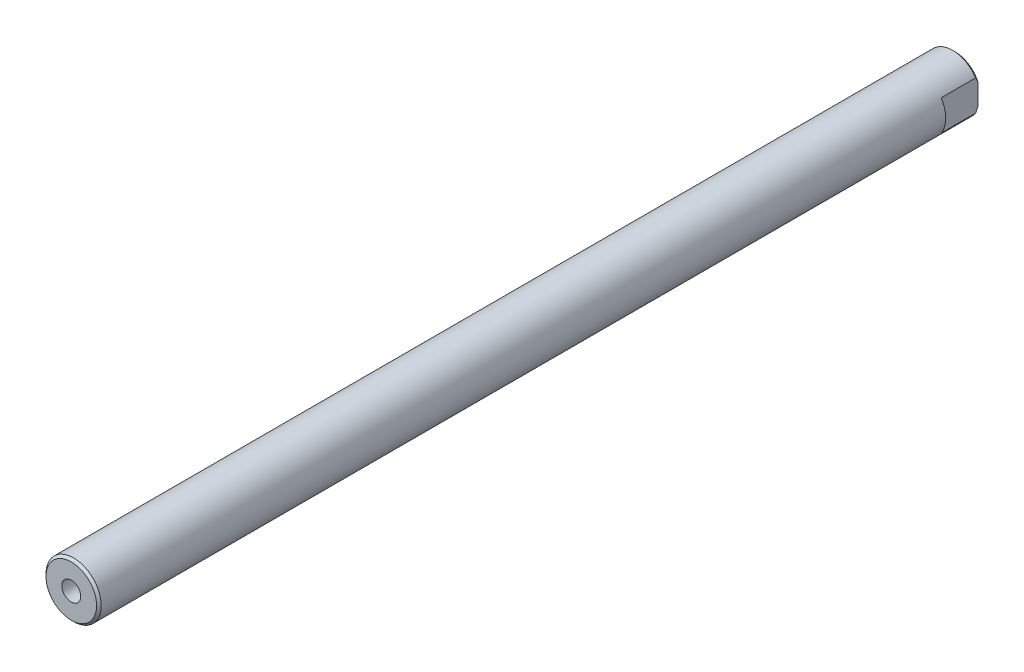
ISO-10303-21;
HEADER;
FILE_DESCRIPTION(('STEP AP214'),'2;1');
FILE_NAME('part.step','',(''),(''),'','','');
FILE_SCHEMA(('AUTOMOTIVE_DESIGN { 1 0 10303 214 1 1 1 1 }'));
ENDSEC;
DATA;
#1=APPLICATION_CONTEXT('core data for automotive mechanical design processes');
#2=APPLICATION_PROTOCOL_DEFINITION('international standard','automotive_design',2000,#1);
#3=PRODUCT_CONTEXT('',#1,'mechanical');
#4=PRODUCT('Part','Part','',(#3));
#5=PRODUCT_RELATED_PRODUCT_CATEGORY('part','',(#4));
#6=PRODUCT_DEFINITION_FORMATION('','',#4);
#7=PRODUCT_DEFINITION_CONTEXT('part definition',#1,'design');
#8=PRODUCT_DEFINITION('design','',#6,#7);
#9=PRODUCT_DEFINITION_SHAPE('','',#8);
#10=(LENGTH_UNIT() NAMED_UNIT(*) SI_UNIT(.MILLI.,.METRE.));
#11=(NAMED_UNIT(*) PLANE_ANGLE_UNIT() SI_UNIT($,.RADIAN.));
#12=(NAMED_UNIT(*) SI_UNIT($,.STERADIAN.) SOLID_ANGLE_UNIT());
#13=UNCERTAINTY_MEASURE_WITH_UNIT(LENGTH_MEASURE(1.E-05),#10,'distance_accuracy_value','');
#14=(GEOMETRIC_REPRESENTATION_CONTEXT(3) GLOBAL_UNCERTAINTY_ASSIGNED_CONTEXT((#13)) GLOBAL_UNIT_ASSIGNED_CONTEXT((#10,
#11,#12)) REPRESENTATION_CONTEXT('',''));
#15=CARTESIAN_POINT('',(0.,0.,0.));
#16=DIRECTION('',(0.,0.,1.));
#17=DIRECTION('',(1.,0.,0.));
#18=AXIS2_PLACEMENT_3D('',#15,#16,#17);
#19=CARTESIAN_POINT('',(0.,0.,0.793750000000149));
#20=DIRECTION('',(0.,0.,1.));
#21=DIRECTION('',(1.,0.,0.));
#22=AXIS2_PLACEMENT_3D('',#19,#20,#21);
#23=CONICAL_SURFACE('',#22,9.525,0.785398163397464);
#24=CARTESIAN_POINT('',(-7.9375,11.6014360034925,5.32567795717243));
#25=CARTESIAN_POINT('',(-7.9375,11.3954741282638,5.15570776723856));
#26=CARTESIAN_POINT('',(-7.9375,11.1888141040513,4.98657786812083));
#27=CARTESIAN_POINT('',(-7.9375,10.7738848658229,4.65029059370863));
#28=CARTESIAN_POINT('',(-7.9375,10.5656155993229,4.48313328320164));
#29=CARTESIAN_POINT('',(-7.9375,10.1470080264703,4.15088760550852));
#30=CARTESIAN_POINT('',(-7.9375,9.93666746697199,3.98580207327672));
#31=CARTESIAN_POINT('',(-7.9375,9.51392132690025,3.65829127244558));
#32=CARTESIAN_POINT('',(-7.9375,9.30151573600521,3.49586601715399));
#33=CARTESIAN_POINT('',(-7.9375,8.86948446203999,3.17047280109903));
#34=CARTESIAN_POINT('',(-7.9375,8.64980452362687,3.00757675080383));
#35=CARTESIAN_POINT('',(-7.9375,8.20762068370955,2.68566572531648));
#36=CARTESIAN_POINT('',(-7.9375,7.9851168381941,2.52665067335909));
#37=CARTESIAN_POINT('',(-7.9375,7.53694950119995,2.21333045940023));
#38=CARTESIAN_POINT('',(-7.9375,7.3112874008082,2.05902331342647));
#39=CARTESIAN_POINT('',(-7.9375,6.85623203289005,1.75602898709473));
#40=CARTESIAN_POINT('',(-7.9375,6.62683896629286,1.60734150551671));
#41=CARTESIAN_POINT('',(-7.9375,6.09743217351012,1.27518215385517));
#42=CARTESIAN_POINT('',(-7.9375,5.79600650697764,1.09394234503633));
#43=CARTESIAN_POINT('',(-7.9375,5.18479308583082,0.746241008845733));
#44=CARTESIAN_POINT('',(-7.9375,4.87500790022603,0.57977500720809));
#45=CARTESIAN_POINT('',(-7.9375,4.24717673370327,0.26700886733065));
#46=CARTESIAN_POINT('',(-7.9375,3.92917773276971,0.120615453319362));
#47=CARTESIAN_POINT('',(-7.9375,3.28264467487299,-0.146773886604975));
#48=CARTESIAN_POINT('',(-7.9375,2.95411664296996,-0.267784048750884));
#49=CARTESIAN_POINT('',(-7.9375,2.3901421033224,-0.444580000607309));
#50=CARTESIAN_POINT('',(-7.9375,2.15739698732743,-0.508957586163685));
#51=CARTESIAN_POINT('',(-7.9375,1.68759488708778,-0.619541449607157));
#52=CARTESIAN_POINT('',(-7.9375,1.45053850437819,-0.665750242474339));
#53=CARTESIAN_POINT('',(-7.9375,0.973982925679542,-0.737673554850526));
#54=CARTESIAN_POINT('',(-7.9375,0.734492600319058,-0.763446017674142));
#55=CARTESIAN_POINT('',(-7.9375,0.254149503311977,-0.793299105345449));
#56=CARTESIAN_POINT('',(-7.9375,0.0132967829865174,-0.797380541913547));
#57=CARTESIAN_POINT('',(-7.9375,-0.468009612623792,-0.783608551396996));
#58=CARTESIAN_POINT('',(-7.9375,-0.70846265402124,-0.765733335389718));
#59=CARTESIAN_POINT('',(-7.9375,-1.18686519119779,-0.709024715447612));
#60=CARTESIAN_POINT('',(-7.9375,-1.42481446713333,-0.670189486514935));
#61=CARTESIAN_POINT('',(-7.9375,-1.89757315431518,-0.573374556133903));
#62=CARTESIAN_POINT('',(-7.9375,-2.13236916585276,-0.51533031770074));
#63=CARTESIAN_POINT('',(-7.9375,-2.59715748152029,-0.382627814204618));
#64=CARTESIAN_POINT('',(-7.9375,-2.82714974617842,-0.307969412683753));
#65=CARTESIAN_POINT('',(-7.9375,-3.32292514190079,-0.129913750873734));
#66=CARTESIAN_POINT('',(-7.9375,-3.58771252050722,-0.0237629755832509));
#67=CARTESIAN_POINT('',(-7.9375,-4.11045852754002,0.204320036250611));
#68=CARTESIAN_POINT('',(-7.9375,-4.36841392511831,0.326259584287772));
#69=CARTESIAN_POINT('',(-7.9375,-4.87840789335136,0.582939808835037));
#70=CARTESIAN_POINT('',(-7.9375,-5.13043498776631,0.717703114549743));
#71=CARTESIAN_POINT('',(-7.9375,-5.62876456164695,0.997283684746736));
#72=CARTESIAN_POINT('',(-7.9375,-5.87506786030298,1.14209949853624));
#73=CARTESIAN_POINT('',(-7.9375,-6.36431013173231,1.44079890476715));
#74=CARTESIAN_POINT('',(-7.9375,-6.60721644348262,1.59473574090025));
#75=CARTESIAN_POINT('',(-7.9375,-7.08868671208285,1.90924675489272));
#76=CARTESIAN_POINT('',(-7.9375,-7.32725054237946,2.0698211257457));
#77=CARTESIAN_POINT('',(-7.9375,-7.80040441956701,2.39623490523143));
#78=CARTESIAN_POINT('',(-7.9375,-8.03499801323439,2.56206918774313));
#79=CARTESIAN_POINT('',(-7.9375,-8.500952099172,2.89819833973861));
#80=CARTESIAN_POINT('',(-7.9375,-8.73231266321962,3.06849310995179));
#81=CARTESIAN_POINT('',(-7.9375,-9.18794896552464,3.409587365432));
#82=CARTESIAN_POINT('',(-7.9375,-9.41227632364913,3.58031802966819));
#83=CARTESIAN_POINT('',(-7.9375,-9.85861577505485,3.9248191689226));
#84=CARTESIAN_POINT('',(-7.9375,-10.0806276446775,4.09858993332941));
#85=CARTESIAN_POINT('',(-7.9375,-10.5200922126934,4.44670278107558));
#86=CARTESIAN_POINT('',(-7.9375,-10.7375680282526,4.62101572569596));
#87=CARTESIAN_POINT('',(-7.9375,-11.1707609997737,4.97180733271033));
#88=CARTESIAN_POINT('',(-7.9375,-11.3864781840771,5.14828596008746));
#89=CARTESIAN_POINT('',(-7.9375,-11.6014360034926,5.32567795717243));
#90=B_SPLINE_CURVE_WITH_KNOTS('',3,(#24,#25,#26,#27,#28,#29,#30,#31,#32,#33,#34,#35,#36,#37,#38,
#39,#40,#41,#42,#43,#44,#45,#46,#47,#48,#49,#50,#51,#52,#53,#54,#55,#56,#57,#58,#59,#60,#61,#62,
#63,#64,#65,#66,#67,#68,#69,#70,#71,#72,#73,#74,#75,#76,#77,#78,#79,#80,#81,#82,#83,#84,#85,#86,
#87,#88,#89),.UNSPECIFIED.,.F.,.F.,(4,2,2,2,2,2,2,2,2,2,2,2,2,2,2,2,2,2,2,2,2,2,2,2,2,2,2,2,2,2,
2,2,4),(0.,0.801122014064893,1.60227026726658,2.40441595709641,3.20656565834575,
4.02698671789724,4.84739153654247,5.66744571188917,6.48745586893487,7.54228804991552,
8.59679967569598,9.64623175308704,10.6950736719304,11.4189157513683,12.1426575990584,
12.8643400033196,13.5859954006309,14.3083675194414,15.0308025456699,15.7556898223754,
16.4805830530523,17.3357464059968,18.1913071954248,19.0484067663654,19.9053829040754,
20.7679797303853,21.6306016553112,22.4924072773821,23.3541937357677,24.1998858025455,
25.0456588139614,25.8817820988934,26.7178918823395),.UNSPECIFIED.);
#91=CARTESIAN_POINT('',(-7.9375,5.2651418546892,0.793750000000371));
#92=VERTEX_POINT('',#91);
#93=CARTESIAN_POINT('',(-7.9375,3.63741945787052,0.));
#94=VERTEX_POINT('',#93);
#95=EDGE_CURVE('E11',#92,#94,#90,.T.);
#96=ORIENTED_EDGE('',*,*,#95,.F.);
#97=CARTESIAN_POINT('',(0.,0.,0.793750000000149));
#98=DIRECTION('',(0.,0.,1.));
#99=DIRECTION('',(1.,0.,0.));
#100=AXIS2_PLACEMENT_3D('',#97,#98,#99);
#101=CIRCLE('',#100,9.525);
#102=CARTESIAN_POINT('',(7.9375,5.2651418546892,0.793750000000371));
#103=VERTEX_POINT('',#102);
#104=EDGE_CURVE('E115',#103,#92,#101,.T.);
#105=ORIENTED_EDGE('',*,*,#104,.F.);
#106=CARTESIAN_POINT('',(7.9375,-11.6014360034926,5.32567795717243));
#107=CARTESIAN_POINT('',(7.9375,-11.3954741282639,5.15570776723858));
#108=CARTESIAN_POINT('',(7.9375,-11.1888141040513,4.98657786812085));
#109=CARTESIAN_POINT('',(7.9375,-10.7738848658229,4.65029059370865));
#110=CARTESIAN_POINT('',(7.9375,-10.5656155993229,4.48313328320165));
#111=CARTESIAN_POINT('',(7.9375,-10.1470080264703,4.15088760550853));
#112=CARTESIAN_POINT('',(7.9375,-9.93666746697201,3.98580207327673));
#113=CARTESIAN_POINT('',(7.9375,-9.51392132690026,3.6582912724456));
#114=CARTESIAN_POINT('',(7.9375,-9.30151573600523,3.495866017154));
#115=CARTESIAN_POINT('',(7.9375,-8.86948446204,3.17047280109904));
#116=CARTESIAN_POINT('',(7.9375,-8.64980452362688,3.00757675080384));
#117=CARTESIAN_POINT('',(7.9375,-8.20762068370956,2.68566572531649));
#118=CARTESIAN_POINT('',(7.9375,-7.9851168381941,2.5266506733591));
#119=CARTESIAN_POINT('',(7.9375,-7.53694950119996,2.21333045940023));
#120=CARTESIAN_POINT('',(7.9375,-7.3112874008082,2.05902331342647));
#121=CARTESIAN_POINT('',(7.9375,-6.85623203289005,1.75602898709473));
#122=CARTESIAN_POINT('',(7.9375,-6.62683896629286,1.60734150551671));
#123=CARTESIAN_POINT('',(7.9375,-6.09743217351012,1.27518215385517));
#124=CARTESIAN_POINT('',(7.9375,-5.79600650697764,1.09394234503633));
#125=CARTESIAN_POINT('',(7.9375,-5.18479308583082,0.746241008845733));
#126=CARTESIAN_POINT('',(7.9375,-4.87500790022603,0.57977500720809));
#127=CARTESIAN_POINT('',(7.9375,-4.24717673370327,0.26700886733065));
#128=CARTESIAN_POINT('',(7.9375,-3.92917773276971,0.120615453319362));
#129=CARTESIAN_POINT('',(7.9375,-3.28264467487299,-0.146773886604975));
#130=CARTESIAN_POINT('',(7.9375,-2.95411664296996,-0.267784048750884));
#131=CARTESIAN_POINT('',(7.9375,-2.3901421033224,-0.444580000607309));
#132=CARTESIAN_POINT('',(7.9375,-2.15739698732743,-0.508957586163685));
#133=CARTESIAN_POINT('',(7.9375,-1.68759488708778,-0.619541449607157));
#134=CARTESIAN_POINT('',(7.9375,-1.45053850437819,-0.665750242474339));
#135=CARTESIAN_POINT('',(7.9375,-0.973982925679542,-0.737673554850526));
#136=CARTESIAN_POINT('',(7.9375,-0.734492600319058,-0.763446017674142));
#137=CARTESIAN_POINT('',(7.9375,-0.254149503311977,-0.793299105345449));
#138=CARTESIAN_POINT('',(7.9375,-0.0132967829865175,-0.797380541913547));
#139=CARTESIAN_POINT('',(7.9375,0.468009612623792,-0.783608551396996));
#140=CARTESIAN_POINT('',(7.9375,0.708462654021241,-0.765733335389718));
#141=CARTESIAN_POINT('',(7.9375,1.18686519119779,-0.709024715447612));
#142=CARTESIAN_POINT('',(7.9375,1.42481446713333,-0.670189486514935));
#143=CARTESIAN_POINT('',(7.9375,1.89757315431518,-0.573374556133903));
#144=CARTESIAN_POINT('',(7.9375,2.13236916585276,-0.51533031770074));
#145=CARTESIAN_POINT('',(7.9375,2.59715748152029,-0.382627814204619));
#146=CARTESIAN_POINT('',(7.9375,2.82714974617842,-0.307969412683753));
#147=CARTESIAN_POINT('',(7.9375,3.32292514190079,-0.129913750873734));
#148=CARTESIAN_POINT('',(7.9375,3.58771252050722,-0.0237629755832519));
#149=CARTESIAN_POINT('',(7.9375,4.11045852754002,0.204320036250608));
#150=CARTESIAN_POINT('',(7.9375,4.3684139251183,0.32625958428777));
#151=CARTESIAN_POINT('',(7.9375,4.87840789335135,0.582939808835032));
#152=CARTESIAN_POINT('',(7.9375,5.1304349877663,0.717703114549736));
#153=CARTESIAN_POINT('',(7.9375,5.62876456164694,0.997283684746727));
#154=CARTESIAN_POINT('',(7.9375,5.87506786030297,1.14209949853624));
#155=CARTESIAN_POINT('',(7.9375,6.36431013173229,1.44079890476714));
#156=CARTESIAN_POINT('',(7.9375,6.6072164434826,1.59473574090024));
#157=CARTESIAN_POINT('',(7.9375,7.08868671208283,1.90924675489271));
#158=CARTESIAN_POINT('',(7.9375,7.32725054237944,2.06982112574569));
#159=CARTESIAN_POINT('',(7.9375,7.80040441956699,2.39623490523141));
#160=CARTESIAN_POINT('',(7.9375,8.03499801323438,2.56206918774311));
#161=CARTESIAN_POINT('',(7.9375,8.50095209917196,2.89819833973859));
#162=CARTESIAN_POINT('',(7.9375,8.73231266321957,3.06849310995179));
#163=CARTESIAN_POINT('',(7.9375,9.18794896552459,3.409587365432));
#164=CARTESIAN_POINT('',(7.9375,9.4122763236491,3.58031802966818));
#165=CARTESIAN_POINT('',(7.9375,9.85861577505483,3.92481916892257));
#166=CARTESIAN_POINT('',(7.9375,10.0806276446775,4.09858993332938));
#167=CARTESIAN_POINT('',(7.9375,10.5200922126934,4.44670278107556));
#168=CARTESIAN_POINT('',(7.9375,10.7375680282526,4.62101572569594));
#169=CARTESIAN_POINT('',(7.9375,11.1707609997737,4.97180733271031));
#170=CARTESIAN_POINT('',(7.9375,11.3864781840771,5.14828596008745));
#171=CARTESIAN_POINT('',(7.9375,11.6014360034925,5.32567795717243));
#172=B_SPLINE_CURVE_WITH_KNOTS('',3,(#106,#107,#108,#109,#110,#111,#112,#113,#114,#115,#116,
#117,#118,#119,#120,#121,#122,#123,#124,#125,#126,#127,#128,#129,#130,#131,#132,#133,#134,#135,
#136,#137,#138,#139,#140,#141,#142,#143,#144,#145,#146,#147,#148,#149,#150,#151,#152,#153,#154,
#155,#156,#157,#158,#159,#160,#161,#162,#163,#164,#165,#166,#167,#168,#169,#170,#171),
.UNSPECIFIED.,.F.,.F.,(4,2,2,2,2,2,2,2,2,2,2,2,2,2,2,2,2,2,2,2,2,2,2,2,2,2,2,2,2,2,2,2,4),(0.,
0.801122014064897,1.60227026726659,2.40441595709642,3.20656565834576,4.02698671789726,
4.84739153654249,5.66744571188921,6.4874558689349,7.54228804991556,8.59679967569602,
9.64623175308708,10.6950736719304,11.4189157513683,12.1426575990584,12.8643400033196,
13.5859954006309,14.3083675194414,15.0308025456699,15.7556898223754,16.4805830530523,
17.3357464059968,18.1913071954249,19.0484067663654,19.9053829040754,20.7679797303853,
21.6306016553112,22.4924072773821,23.3541937357678,24.1998858025455,25.0456588139614,
25.8817820988934,26.7178918823395),.UNSPECIFIED.);
#173=CARTESIAN_POINT('',(7.9375,3.63741945787052,0.));
#174=VERTEX_POINT('',#173);
#175=EDGE_CURVE('E147',#174,#103,#172,.T.);
#176=ORIENTED_EDGE('',*,*,#175,.F.);
#177=CARTESIAN_POINT('',(0.,0.,0.));
#178=DIRECTION('',(0.,0.,1.));
#179=DIRECTION('',(1.,0.,0.));
#180=AXIS2_PLACEMENT_3D('',#177,#178,#179);
#181=CIRCLE('',#180,8.73124999999972);
#182=EDGE_CURVE('E64',#94,#174,#181,.F.);
#183=ORIENTED_EDGE('',*,*,#182,.F.);
#184=EDGE_LOOP('',(#96,#105,#176,#183));
#185=FACE_BOUND('',#184,.T.);
#186=ADVANCED_FACE('F38',(#185),#23,.T.);
#187=CARTESIAN_POINT('',(0.,0.,304.8));
#188=DIRECTION('',(0.,0.,-1.));
#189=DIRECTION('',(-1.,0.,0.));
#190=AXIS2_PLACEMENT_3D('',#187,#188,#189);
#191=CYLINDRICAL_SURFACE('',#190,9.525);
#192=CARTESIAN_POINT('',(0.,0.,304.00625));
#193=DIRECTION('',(0.,0.,1.));
#194=DIRECTION('',(1.,0.,0.));
#195=AXIS2_PLACEMENT_3D('',#192,#193,#194);
#196=CIRCLE('',#195,9.525);
#197=CARTESIAN_POINT('',(9.525,0.,304.00625));
#198=VERTEX_POINT('',#197);
#199=EDGE_CURVE('E142',#198,#198,#196,.F.);
#200=ORIENTED_EDGE('',*,*,#199,.T.);
#201=EDGE_LOOP('',(#200));
#202=FACE_BOUND('',#201,.T.);
#203=CARTESIAN_POINT('',(0.,0.,12.6999999999999));
#204=DIRECTION('',(0.,0.,-1.));
#205=DIRECTION('',(-1.,0.,0.));
#206=AXIS2_PLACEMENT_3D('',#203,#204,#205);
#207=CIRCLE('',#206,9.525);
#208=CARTESIAN_POINT('',(-7.9375,-5.2651418546892,12.6999999999999));
#209=VERTEX_POINT('',#208);
#210=CARTESIAN_POINT('',(-7.9375,5.2651418546892,12.6999999999999));
#211=VERTEX_POINT('',#210);
#212=EDGE_CURVE('E99',#209,#211,#207,.T.);
#213=ORIENTED_EDGE('',*,*,#212,.F.);
#214=DIRECTION('',(0.,0.,-1.));
#215=VECTOR('',#214,1.);
#216=CARTESIAN_POINT('',(-7.9375,-5.2651418546892,12.6999999999999));
#217=LINE('',#216,#215);
#218=CARTESIAN_POINT('',(-7.9375,-5.2651418546892,0.793750000000371));
#219=VERTEX_POINT('',#218);
#220=EDGE_CURVE('E110',#209,#219,#217,.T.);
#221=ORIENTED_EDGE('',*,*,#220,.T.);
#222=CARTESIAN_POINT('',(7.9375,-5.2651418546892,0.793750000000371));
#223=VERTEX_POINT('',#222);
#224=EDGE_CURVE('E140',#219,#223,#101,.T.);
#225=ORIENTED_EDGE('',*,*,#224,.T.);
#226=DIRECTION('',(0.,0.,-1.));
#227=VECTOR('',#226,1.);
#228=CARTESIAN_POINT('',(7.9375,-5.2651418546892,12.6999999999999));
#229=LINE('',#228,#227);
#230=CARTESIAN_POINT('',(7.9375,-5.2651418546892,12.6999999999999));
#231=VERTEX_POINT('',#230);
#232=EDGE_CURVE('E126',#231,#223,#229,.T.);
#233=ORIENTED_EDGE('',*,*,#232,.F.);
#234=CARTESIAN_POINT('',(0.,0.,12.6999999999999));
#235=DIRECTION('',(0.,0.,-1.));
#236=DIRECTION('',(-1.,0.,0.));
#237=AXIS2_PLACEMENT_3D('',#234,#235,#236);
#238=CIRCLE('',#237,9.525);
#239=CARTESIAN_POINT('',(7.9375,5.2651418546892,12.6999999999999));
#240=VERTEX_POINT('',#239);
#241=EDGE_CURVE('E121',#240,#231,#238,.T.);
#242=ORIENTED_EDGE('',*,*,#241,.F.);
#243=DIRECTION('',(0.,0.,-1.));
#244=VECTOR('',#243,1.);
#245=CARTESIAN_POINT('',(7.9375,5.2651418546892,12.6999999999999));
#246=LINE('',#245,#244);
#247=EDGE_CURVE('E127',#240,#103,#246,.T.);
#248=ORIENTED_EDGE('',*,*,#247,.T.);
#249=ORIENTED_EDGE('',*,*,#104,.T.);
#250=DIRECTION('',(0.,0.,-1.));
#251=VECTOR('',#250,1.);
#252=CARTESIAN_POINT('',(-7.9375,5.2651418546892,12.6999999999999));
#253=LINE('',#252,#251);
#254=EDGE_CURVE('E108',#211,#92,#253,.T.);
#255=ORIENTED_EDGE('',*,*,#254,.F.);
#256=EDGE_LOOP('',(#213,#221,#225,#233,#242,#248,#249,#255));
#257=FACE_BOUND('',#256,.T.);
#258=ADVANCED_FACE('F40',(#202,#257),#191,.T.);
#259=CARTESIAN_POINT('',(0.,0.,304.8));
#260=DIRECTION('',(0.,0.,1.));
#261=DIRECTION('',(1.,0.,0.));
#262=AXIS2_PLACEMENT_3D('',#259,#260,#261);
#263=PLANE('',#262);
#264=CARTESIAN_POINT('',(0.,0.,304.8));
#265=DIRECTION('',(0.,0.,1.));
#266=DIRECTION('',(1.,0.,0.));
#267=AXIS2_PLACEMENT_3D('',#264,#265,#266);
#268=CIRCLE('',#267,3.26389999999999);
#269=CARTESIAN_POINT('',(3.26389999999999,0.,304.8));
#270=VERTEX_POINT('',#269);
#271=EDGE_CURVE('E134',#270,#270,#268,.T.);
#272=ORIENTED_EDGE('',*,*,#271,.F.);
#273=EDGE_LOOP('',(#272));
#274=FACE_BOUND('',#273,.T.);
#275=CARTESIAN_POINT('',(0.,0.,304.8));
#276=DIRECTION('',(0.,0.,1.));
#277=DIRECTION('',(1.,0.,0.));
#278=AXIS2_PLACEMENT_3D('',#275,#276,#277);
#279=CIRCLE('',#278,8.73125000000016);
#280=CARTESIAN_POINT('',(8.73125000000016,0.,304.8));
#281=VERTEX_POINT('',#280);
#282=EDGE_CURVE('E137',#281,#281,#279,.T.);
#283=ORIENTED_EDGE('',*,*,#282,.T.);
#284=EDGE_LOOP('',(#283));
#285=FACE_BOUND('',#284,.T.);
#286=ADVANCED_FACE('F182',(#274,#285),#263,.T.);
#287=CARTESIAN_POINT('',(0.,0.,0.));
#288=DIRECTION('',(0.,0.,1.));
#289=DIRECTION('',(1.,0.,0.));
#290=AXIS2_PLACEMENT_3D('',#287,#288,#289);
#291=PLANE('',#290);
#292=CARTESIAN_POINT('',(7.9375,-3.63741945787052,0.));
#293=VERTEX_POINT('',#292);
#294=CARTESIAN_POINT('',(-7.9375,-3.63741945787052,0.));
#295=VERTEX_POINT('',#294);
#296=EDGE_CURVE('E145',#293,#295,#181,.F.);
#297=ORIENTED_EDGE('',*,*,#296,.T.);
#298=DIRECTION('',(0.,-1.,0.));
#299=VECTOR('',#298,1.);
#300=CARTESIAN_POINT('',(-7.9375,5.2651418546892,0.));
#301=LINE('',#300,#299);
#302=EDGE_CURVE('E57',#94,#295,#301,.T.);
#303=ORIENTED_EDGE('',*,*,#302,.F.);
#304=ORIENTED_EDGE('',*,*,#182,.T.);
#305=DIRECTION('',(0.,1.,0.));
#306=VECTOR('',#305,1.);
#307=CARTESIAN_POINT('',(7.9375,5.2651418546892,0.));
#308=LINE('',#307,#306);
#309=EDGE_CURVE('E117',#293,#174,#308,.T.);
#310=ORIENTED_EDGE('',*,*,#309,.F.);
#311=EDGE_LOOP('',(#297,#303,#304,#310));
#312=FACE_BOUND('',#311,.T.);
#313=ADVANCED_FACE('F185',(#312),#291,.F.);
#314=CARTESIAN_POINT('',(0.,0.,304.8));
#315=DIRECTION('',(0.,0.,-1.));
#316=DIRECTION('',(-1.,0.,0.));
#317=AXIS2_PLACEMENT_3D('',#314,#315,#316);
#318=CONICAL_SURFACE('',#317,8.73125000000016,0.785398163397429);
#319=ORIENTED_EDGE('',*,*,#199,.F.);
#320=EDGE_LOOP('',(#319));
#321=FACE_BOUND('',#320,.T.);
#322=ORIENTED_EDGE('',*,*,#282,.F.);
#323=EDGE_LOOP('',(#322));
#324=FACE_BOUND('',#323,.T.);
#325=ADVANCED_FACE('F173',(#321,#324),#318,.T.);
#326=EDGE_CURVE('E42',#295,#219,#90,.T.);
#327=ORIENTED_EDGE('',*,*,#326,.F.);
#328=ORIENTED_EDGE('',*,*,#296,.F.);
#329=EDGE_CURVE('E152',#223,#293,#172,.T.);
#330=ORIENTED_EDGE('',*,*,#329,.F.);
#331=ORIENTED_EDGE('',*,*,#224,.F.);
#332=EDGE_LOOP('',(#327,#328,#330,#331));
#333=FACE_BOUND('',#332,.T.);
#334=ADVANCED_FACE('F153',(#333),#23,.T.);
#335=CARTESIAN_POINT('',(0.,0.,304.8));
#336=DIRECTION('',(0.,0.,1.));
#337=DIRECTION('',(1.,0.,0.));
#338=AXIS2_PLACEMENT_3D('',#335,#336,#337);
#339=CYLINDRICAL_SURFACE('',#338,3.26389999999999);
#340=CARTESIAN_POINT('',(0.,0.,280.1936992));
#341=DIRECTION('',(0.,0.,1.));
#342=DIRECTION('',(1.,0.,0.));
#343=AXIS2_PLACEMENT_3D('',#340,#341,#342);
#344=CIRCLE('',#343,3.26389999999999);
#345=CARTESIAN_POINT('',(3.26389999999999,0.,280.1936992));
#346=VERTEX_POINT('',#345);
#347=EDGE_CURVE('E129',#346,#346,#344,.T.);
#348=ORIENTED_EDGE('',*,*,#347,.F.);
#349=EDGE_LOOP('',(#348));
#350=FACE_BOUND('',#349,.T.);
#351=ORIENTED_EDGE('',*,*,#271,.T.);
#352=EDGE_LOOP('',(#351));
#353=FACE_BOUND('',#352,.T.);
#354=ADVANCED_FACE('F166',(#350,#353),#339,.F.);
#355=CARTESIAN_POINT('',(0.,0.,280.1936992));
#356=DIRECTION('',(0.,0.,1.));
#357=DIRECTION('',(1.,0.,0.));
#358=AXIS2_PLACEMENT_3D('',#355,#356,#357);
#359=CONICAL_SURFACE('',#358,3.26389999999999,1.02974425867665);
#360=CARTESIAN_POINT('',(0.,0.,278.232550225556));
#361=VERTEX_POINT('',#360);
#362=VERTEX_LOOP('',#361);
#363=FACE_BOUND('',#362,.T.);
#364=ORIENTED_EDGE('',*,*,#347,.T.);
#365=EDGE_LOOP('',(#364));
#366=FACE_BOUND('',#365,.T.);
#367=ADVANCED_FACE('F163',(#363,#366),#359,.F.);
#368=CARTESIAN_POINT('',(7.9375,5.2651418546892,12.6999999999999));
#369=DIRECTION('',(-1.,0.,0.));
#370=DIRECTION('',(0.,0.,1.));
#371=AXIS2_PLACEMENT_3D('',#368,#369,#370);
#372=PLANE('',#371);
#373=ORIENTED_EDGE('',*,*,#329,.T.);
#374=ORIENTED_EDGE('',*,*,#309,.T.);
#375=ORIENTED_EDGE('',*,*,#175,.T.);
#376=ORIENTED_EDGE('',*,*,#247,.F.);
#377=DIRECTION('',(0.,1.,0.));
#378=VECTOR('',#377,1.);
#379=CARTESIAN_POINT('',(7.9375,5.2651418546892,12.6999999999999));
#380=LINE('',#379,#378);
#381=EDGE_CURVE('E123',#231,#240,#380,.T.);
#382=ORIENTED_EDGE('',*,*,#381,.F.);
#383=ORIENTED_EDGE('',*,*,#232,.T.);
#384=EDGE_LOOP('',(#373,#374,#375,#376,#382,#383));
#385=FACE_BOUND('',#384,.T.);
#386=ADVANCED_FACE('F157',(#385),#372,.F.);
#387=CARTESIAN_POINT('',(0.,0.,12.6999999999999));
#388=DIRECTION('',(0.,0.,-1.));
#389=DIRECTION('',(-1.,0.,0.));
#390=AXIS2_PLACEMENT_3D('',#387,#388,#389);
#391=PLANE('',#390);
#392=ORIENTED_EDGE('',*,*,#241,.T.);
#393=ORIENTED_EDGE('',*,*,#381,.T.);
#394=EDGE_LOOP('',(#392,#393));
#395=FACE_BOUND('',#394,.T.);
#396=ADVANCED_FACE('F162',(#395),#391,.T.);
#397=CARTESIAN_POINT('',(-7.9375,5.2651418546892,12.6999999999999));
#398=DIRECTION('',(1.,0.,0.));
#399=DIRECTION('',(0.,0.,-1.));
#400=AXIS2_PLACEMENT_3D('',#397,#398,#399);
#401=PLANE('',#400);
#402=ORIENTED_EDGE('',*,*,#95,.T.);
#403=ORIENTED_EDGE('',*,*,#302,.T.);
#404=ORIENTED_EDGE('',*,*,#326,.T.);
#405=ORIENTED_EDGE('',*,*,#220,.F.);
#406=DIRECTION('',(0.,-1.,0.));
#407=VECTOR('',#406,1.);
#408=CARTESIAN_POINT('',(-7.9375,5.2651418546892,12.6999999999999));
#409=LINE('',#408,#407);
#410=EDGE_CURVE('E102',#211,#209,#409,.T.);
#411=ORIENTED_EDGE('',*,*,#410,.F.);
#412=ORIENTED_EDGE('',*,*,#254,.T.);
#413=EDGE_LOOP('',(#402,#403,#404,#405,#411,#412));
#414=FACE_BOUND('',#413,.T.);
#415=ADVANCED_FACE('F107',(#414),#401,.F.);
#416=CARTESIAN_POINT('',(0.,0.,12.6999999999999));
#417=DIRECTION('',(0.,0.,-1.));
#418=DIRECTION('',(-1.,0.,0.));
#419=AXIS2_PLACEMENT_3D('',#416,#417,#418);
#420=PLANE('',#419);
#421=ORIENTED_EDGE('',*,*,#212,.T.);
#422=ORIENTED_EDGE('',*,*,#410,.T.);
#423=EDGE_LOOP('',(#421,#422));
#424=FACE_BOUND('',#423,.T.);
#425=ADVANCED_FACE('F101',(#424),#420,.T.);
#426=CLOSED_SHELL('',(#186,#258,#286,#313,#325,#334,#354,#367,#386,#396,#415,#425));
#427=MANIFOLD_SOLID_BREP('B2',#426);
#428=ADVANCED_BREP_SHAPE_REPRESENTATION('',(#18,#427),#14);
#429=SHAPE_DEFINITION_REPRESENTATION(#9,#428);
ENDSEC;
END-ISO-10303-21;
